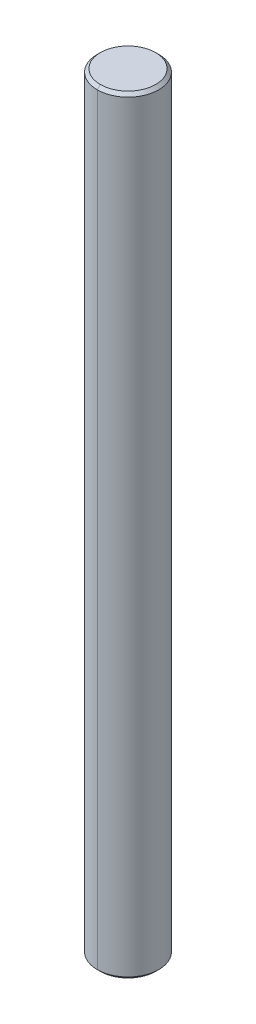
ISO-10303-21;
HEADER;
FILE_DESCRIPTION(('STEP AP214'),'2;1');
FILE_NAME('part.step','',(''),(''),'','','');
FILE_SCHEMA(('AUTOMOTIVE_DESIGN { 1 0 10303 214 1 1 1 1 }'));
ENDSEC;
DATA;
#1=APPLICATION_CONTEXT('core data for automotive mechanical design processes');
#2=APPLICATION_PROTOCOL_DEFINITION('international standard','automotive_design',2000,#1);
#3=PRODUCT_CONTEXT('',#1,'mechanical');
#4=PRODUCT('Part','Part','',(#3));
#5=PRODUCT_RELATED_PRODUCT_CATEGORY('part','',(#4));
#6=PRODUCT_DEFINITION_FORMATION('','',#4);
#7=PRODUCT_DEFINITION_CONTEXT('part definition',#1,'design');
#8=PRODUCT_DEFINITION('design','',#6,#7);
#9=PRODUCT_DEFINITION_SHAPE('','',#8);
#10=(LENGTH_UNIT() NAMED_UNIT(*) SI_UNIT(.MILLI.,.METRE.));
#11=(NAMED_UNIT(*) PLANE_ANGLE_UNIT() SI_UNIT($,.RADIAN.));
#12=(NAMED_UNIT(*) SI_UNIT($,.STERADIAN.) SOLID_ANGLE_UNIT());
#13=UNCERTAINTY_MEASURE_WITH_UNIT(LENGTH_MEASURE(1.E-05),#10,'distance_accuracy_value','');
#14=(GEOMETRIC_REPRESENTATION_CONTEXT(3) GLOBAL_UNCERTAINTY_ASSIGNED_CONTEXT((#13)) GLOBAL_UNIT_ASSIGNED_CONTEXT((#10,
#11,#12)) REPRESENTATION_CONTEXT('',''));
#15=CARTESIAN_POINT('',(0.,0.,0.));
#16=DIRECTION('',(0.,0.,1.));
#17=DIRECTION('',(1.,0.,0.));
#18=AXIS2_PLACEMENT_3D('',#15,#16,#17);
#19=CARTESIAN_POINT('',(0.,0.200000000000019,0.));
#20=DIRECTION('',(0.,1.,0.));
#21=DIRECTION('',(0.,0.,1.));
#22=AXIS2_PLACEMENT_3D('',#19,#20,#21);
#23=CONICAL_SURFACE('',#22,2.,0.785398163397425);
#24=DIRECTION('',(0.,0.707106781186564,-0.707106781186532));
#25=VECTOR('',#24,1.);
#26=CARTESIAN_POINT('',(0.,0.200000000000019,-2.));
#27=LINE('',#26,#25);
#28=CARTESIAN_POINT('',(0.,0.,-1.8));
#29=VERTEX_POINT('',#28);
#30=CARTESIAN_POINT('',(0.,0.200000000000019,-2.));
#31=VERTEX_POINT('',#30);
#32=EDGE_CURVE('E102',#29,#31,#27,.T.);
#33=ORIENTED_EDGE('',*,*,#32,.F.);
#34=CARTESIAN_POINT('',(0.,0.,0.));
#35=DIRECTION('',(0.,-1.,0.));
#36=DIRECTION('',(0.,0.,1.));
#37=AXIS2_PLACEMENT_3D('',#34,#35,#36);
#38=CIRCLE('',#37,1.8);
#39=CARTESIAN_POINT('',(0.,0.,1.8));
#40=VERTEX_POINT('',#39);
#41=EDGE_CURVE('E11',#40,#29,#38,.T.);
#42=ORIENTED_EDGE('',*,*,#41,.F.);
#43=DIRECTION('',(0.,0.707106781186564,0.707106781186532));
#44=VECTOR('',#43,1.);
#45=CARTESIAN_POINT('',(0.,0.200000000000019,2.));
#46=LINE('',#45,#44);
#47=CARTESIAN_POINT('',(0.,0.200000000000019,2.));
#48=VERTEX_POINT('',#47);
#49=EDGE_CURVE('E94',#40,#48,#46,.T.);
#50=ORIENTED_EDGE('',*,*,#49,.T.);
#51=CARTESIAN_POINT('',(0.,0.200000000000019,0.));
#52=DIRECTION('',(0.,1.,0.));
#53=DIRECTION('',(0.,0.,1.));
#54=AXIS2_PLACEMENT_3D('',#51,#52,#53);
#55=CIRCLE('',#54,2.);
#56=EDGE_CURVE('E71',#31,#48,#55,.T.);
#57=ORIENTED_EDGE('',*,*,#56,.F.);
#58=EDGE_LOOP('',(#33,#42,#50,#57));
#59=FACE_BOUND('',#58,.T.);
#60=ADVANCED_FACE('F16',(#59),#23,.T.);
#61=CARTESIAN_POINT('',(0.,50.,0.));
#62=DIRECTION('',(0.,-1.,0.));
#63=DIRECTION('',(0.,0.,-1.));
#64=AXIS2_PLACEMENT_3D('',#61,#62,#63);
#65=CONICAL_SURFACE('',#64,1.8,0.785398163397443);
#66=DIRECTION('',(0.,-0.707106781186552,0.707106781186544));
#67=VECTOR('',#66,1.);
#68=CARTESIAN_POINT('',(0.,50.,1.8));
#69=LINE('',#68,#67);
#70=CARTESIAN_POINT('',(0.,50.,1.8));
#71=VERTEX_POINT('',#70);
#72=CARTESIAN_POINT('',(0.,49.8,2.));
#73=VERTEX_POINT('',#72);
#74=EDGE_CURVE('E116',#71,#73,#69,.T.);
#75=ORIENTED_EDGE('',*,*,#74,.F.);
#76=CARTESIAN_POINT('',(0.,50.,0.));
#77=DIRECTION('',(0.,1.,0.));
#78=DIRECTION('',(0.,0.,1.));
#79=AXIS2_PLACEMENT_3D('',#76,#77,#78);
#80=CIRCLE('',#79,1.8);
#81=CARTESIAN_POINT('',(0.,50.,-1.8));
#82=VERTEX_POINT('',#81);
#83=EDGE_CURVE('E19',#82,#71,#80,.T.);
#84=ORIENTED_EDGE('',*,*,#83,.F.);
#85=DIRECTION('',(0.,-0.707106781186552,-0.707106781186544));
#86=VECTOR('',#85,1.);
#87=CARTESIAN_POINT('',(0.,50.,-1.8));
#88=LINE('',#87,#86);
#89=CARTESIAN_POINT('',(0.,49.8,-2.));
#90=VERTEX_POINT('',#89);
#91=EDGE_CURVE('E91',#82,#90,#88,.T.);
#92=ORIENTED_EDGE('',*,*,#91,.T.);
#93=CARTESIAN_POINT('',(0.,49.8,0.));
#94=DIRECTION('',(0.,-1.,0.));
#95=DIRECTION('',(0.,0.,1.));
#96=AXIS2_PLACEMENT_3D('',#93,#94,#95);
#97=CIRCLE('',#96,2.);
#98=EDGE_CURVE('E38',#73,#90,#97,.T.);
#99=ORIENTED_EDGE('',*,*,#98,.F.);
#100=EDGE_LOOP('',(#75,#84,#92,#99));
#101=FACE_BOUND('',#100,.T.);
#102=ADVANCED_FACE('F245',(#101),#65,.T.);
#103=CARTESIAN_POINT('',(0.,0.,0.));
#104=DIRECTION('',(0.,1.,0.));
#105=DIRECTION('',(1.,0.,0.));
#106=AXIS2_PLACEMENT_3D('',#103,#104,#105);
#107=PLANE('',#106);
#108=ORIENTED_EDGE('',*,*,#41,.T.);
#109=CARTESIAN_POINT('',(0.,0.,0.));
#110=DIRECTION('',(0.,-1.,0.));
#111=DIRECTION('',(0.,0.,1.));
#112=AXIS2_PLACEMENT_3D('',#109,#110,#111);
#113=CIRCLE('',#112,1.8);
#114=EDGE_CURVE('E109',#29,#40,#113,.T.);
#115=ORIENTED_EDGE('',*,*,#114,.T.);
#116=EDGE_LOOP('',(#108,#115));
#117=FACE_BOUND('',#116,.T.);
#118=ADVANCED_FACE('F236',(#117),#107,.F.);
#119=CARTESIAN_POINT('',(0.,50.,0.));
#120=DIRECTION('',(0.,1.,0.));
#121=DIRECTION('',(1.,0.,0.));
#122=AXIS2_PLACEMENT_3D('',#119,#120,#121);
#123=PLANE('',#122);
#124=ORIENTED_EDGE('',*,*,#83,.T.);
#125=CARTESIAN_POINT('',(0.,50.,0.));
#126=DIRECTION('',(0.,1.,0.));
#127=DIRECTION('',(0.,0.,1.));
#128=AXIS2_PLACEMENT_3D('',#125,#126,#127);
#129=CIRCLE('',#128,1.8);
#130=EDGE_CURVE('E99',#71,#82,#129,.T.);
#131=ORIENTED_EDGE('',*,*,#130,.T.);
#132=EDGE_LOOP('',(#124,#131));
#133=FACE_BOUND('',#132,.T.);
#134=ADVANCED_FACE('F228',(#133),#123,.T.);
#135=CARTESIAN_POINT('',(0.,50.,0.));
#136=DIRECTION('',(0.,-1.,0.));
#137=DIRECTION('',(0.,0.,-1.));
#138=AXIS2_PLACEMENT_3D('',#135,#136,#137);
#139=CYLINDRICAL_SURFACE('',#138,2.);
#140=DIRECTION('',(0.,-1.,0.));
#141=VECTOR('',#140,1.);
#142=CARTESIAN_POINT('',(0.,50.,2.));
#143=LINE('',#142,#141);
#144=EDGE_CURVE('E74',#73,#48,#143,.T.);
#145=ORIENTED_EDGE('',*,*,#144,.F.);
#146=ORIENTED_EDGE('',*,*,#98,.T.);
#147=DIRECTION('',(0.,-1.,0.));
#148=VECTOR('',#147,1.);
#149=CARTESIAN_POINT('',(0.,50.,-2.));
#150=LINE('',#149,#148);
#151=EDGE_CURVE('E76',#90,#31,#150,.T.);
#152=ORIENTED_EDGE('',*,*,#151,.T.);
#153=ORIENTED_EDGE('',*,*,#56,.T.);
#154=EDGE_LOOP('',(#145,#146,#152,#153));
#155=FACE_BOUND('',#154,.T.);
#156=ADVANCED_FACE('F73',(#155),#139,.T.);
#157=CARTESIAN_POINT('',(0.,50.,0.));
#158=DIRECTION('',(0.,-1.,0.));
#159=DIRECTION('',(0.,0.,-1.));
#160=AXIS2_PLACEMENT_3D('',#157,#158,#159);
#161=CYLINDRICAL_SURFACE('',#160,2.);
#162=CARTESIAN_POINT('',(0.,49.8,0.));
#163=DIRECTION('',(0.,-1.,0.));
#164=DIRECTION('',(0.,0.,1.));
#165=AXIS2_PLACEMENT_3D('',#162,#163,#164);
#166=CIRCLE('',#165,2.);
#167=EDGE_CURVE('E88',#90,#73,#166,.T.);
#168=ORIENTED_EDGE('',*,*,#167,.T.);
#169=ORIENTED_EDGE('',*,*,#144,.T.);
#170=CARTESIAN_POINT('',(0.,0.200000000000019,0.));
#171=DIRECTION('',(0.,1.,0.));
#172=DIRECTION('',(0.,0.,1.));
#173=AXIS2_PLACEMENT_3D('',#170,#171,#172);
#174=CIRCLE('',#173,2.);
#175=EDGE_CURVE('E85',#48,#31,#174,.T.);
#176=ORIENTED_EDGE('',*,*,#175,.T.);
#177=ORIENTED_EDGE('',*,*,#151,.F.);
#178=EDGE_LOOP('',(#168,#169,#176,#177));
#179=FACE_BOUND('',#178,.T.);
#180=ADVANCED_FACE('F83',(#179),#161,.T.);
#181=CARTESIAN_POINT('',(0.,50.,0.));
#182=DIRECTION('',(0.,-1.,0.));
#183=DIRECTION('',(0.,0.,-1.));
#184=AXIS2_PLACEMENT_3D('',#181,#182,#183);
#185=CONICAL_SURFACE('',#184,1.8,0.785398163397443);
#186=ORIENTED_EDGE('',*,*,#130,.F.);
#187=ORIENTED_EDGE('',*,*,#74,.T.);
#188=ORIENTED_EDGE('',*,*,#167,.F.);
#189=ORIENTED_EDGE('',*,*,#91,.F.);
#190=EDGE_LOOP('',(#186,#187,#188,#189));
#191=FACE_BOUND('',#190,.T.);
#192=ADVANCED_FACE('F205',(#191),#185,.T.);
#193=CARTESIAN_POINT('',(0.,0.200000000000019,0.));
#194=DIRECTION('',(0.,1.,0.));
#195=DIRECTION('',(0.,0.,1.));
#196=AXIS2_PLACEMENT_3D('',#193,#194,#195);
#197=CONICAL_SURFACE('',#196,2.,0.785398163397425);
#198=ORIENTED_EDGE('',*,*,#114,.F.);
#199=ORIENTED_EDGE('',*,*,#32,.T.);
#200=ORIENTED_EDGE('',*,*,#175,.F.);
#201=ORIENTED_EDGE('',*,*,#49,.F.);
#202=EDGE_LOOP('',(#198,#199,#200,#201));
#203=FACE_BOUND('',#202,.T.);
#204=ADVANCED_FACE('F101',(#203),#197,.T.);
#205=CLOSED_SHELL('',(#60,#102,#118,#134,#156,#180,#192,#204));
#206=MANIFOLD_SOLID_BREP('B1',#205);
#207=ADVANCED_BREP_SHAPE_REPRESENTATION('',(#18,#206),#14);
#208=SHAPE_DEFINITION_REPRESENTATION(#9,#207);
ENDSEC;
END-ISO-10303-21;
